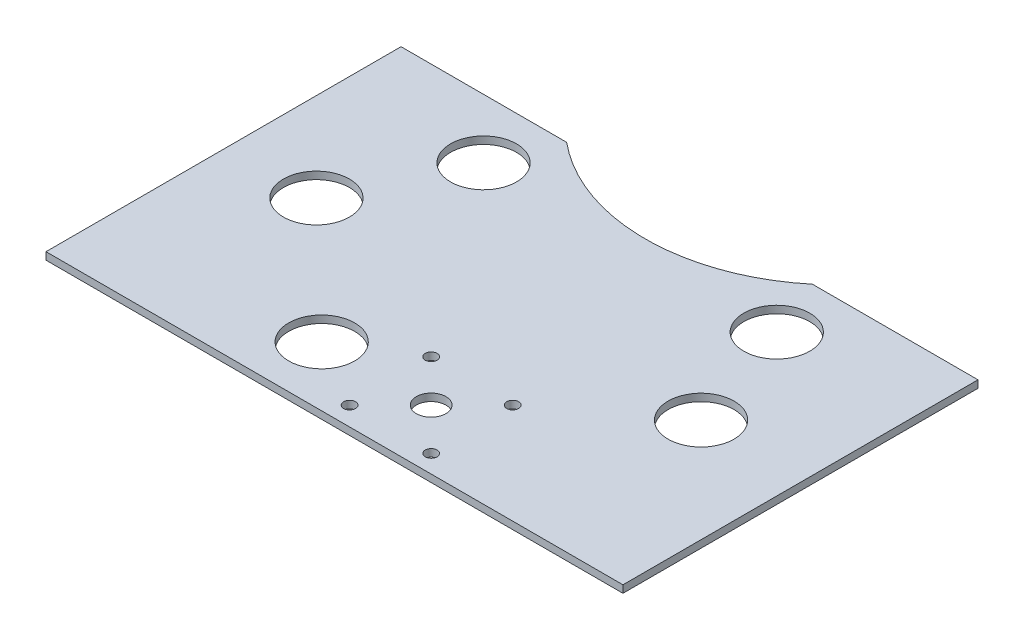
ISO-10303-21;
HEADER;
FILE_DESCRIPTION(('STEP AP214'),'2;1');
FILE_NAME('part.step','',(''),(''),'','','');
FILE_SCHEMA(('AUTOMOTIVE_DESIGN { 1 0 10303 214 1 1 1 1 }'));
ENDSEC;
DATA;
#1=APPLICATION_CONTEXT('core data for automotive mechanical design processes');
#2=APPLICATION_PROTOCOL_DEFINITION('international standard','automotive_design',2000,#1);
#3=PRODUCT_CONTEXT('',#1,'mechanical');
#4=PRODUCT('Part','Part','',(#3));
#5=PRODUCT_RELATED_PRODUCT_CATEGORY('part','',(#4));
#6=PRODUCT_DEFINITION_FORMATION('','',#4);
#7=PRODUCT_DEFINITION_CONTEXT('part definition',#1,'design');
#8=PRODUCT_DEFINITION('design','',#6,#7);
#9=PRODUCT_DEFINITION_SHAPE('','',#8);
#10=(LENGTH_UNIT() NAMED_UNIT(*) SI_UNIT(.MILLI.,.METRE.));
#11=(NAMED_UNIT(*) PLANE_ANGLE_UNIT() SI_UNIT($,.RADIAN.));
#12=(NAMED_UNIT(*) SI_UNIT($,.STERADIAN.) SOLID_ANGLE_UNIT());
#13=UNCERTAINTY_MEASURE_WITH_UNIT(LENGTH_MEASURE(1.E-05),#10,'distance_accuracy_value','');
#14=(GEOMETRIC_REPRESENTATION_CONTEXT(3) GLOBAL_UNCERTAINTY_ASSIGNED_CONTEXT((#13)) GLOBAL_UNIT_ASSIGNED_CONTEXT((#10,
#11,#12)) REPRESENTATION_CONTEXT('',''));
#15=CARTESIAN_POINT('',(0.,0.,0.));
#16=DIRECTION('',(0.,0.,1.));
#17=DIRECTION('',(1.,0.,0.));
#18=AXIS2_PLACEMENT_3D('',#15,#16,#17);
#19=CARTESIAN_POINT('',(-123.825,3.175,-96.52));
#20=DIRECTION('',(0.,0.,-1.));
#21=DIRECTION('',(-1.,0.,0.));
#22=AXIS2_PLACEMENT_3D('',#19,#20,#21);
#23=PLANE('',#22);
#24=DIRECTION('',(1.,0.,0.));
#25=VECTOR('',#24,1.);
#26=CARTESIAN_POINT('',(-123.825,0.,-96.52));
#27=LINE('',#26,#25);
#28=CARTESIAN_POINT('',(-123.825,0.,-96.52));
#29=VERTEX_POINT('',#28);
#30=CARTESIAN_POINT('',(-52.7470615295299,0.,-96.52));
#31=VERTEX_POINT('',#30);
#32=EDGE_CURVE('E129',#29,#31,#27,.T.);
#33=ORIENTED_EDGE('',*,*,#32,.F.);
#34=DIRECTION('',(0.,-1.,0.));
#35=VECTOR('',#34,1.);
#36=CARTESIAN_POINT('',(-123.825,3.175,-96.52));
#37=LINE('',#36,#35);
#38=CARTESIAN_POINT('',(-123.825,3.175,-96.52));
#39=VERTEX_POINT('',#38);
#40=EDGE_CURVE('E11',#39,#29,#37,.T.);
#41=ORIENTED_EDGE('',*,*,#40,.F.);
#42=DIRECTION('',(1.,0.,0.));
#43=VECTOR('',#42,1.);
#44=CARTESIAN_POINT('',(-123.825,3.175,-96.52));
#45=LINE('',#44,#43);
#46=CARTESIAN_POINT('',(-52.7470615295299,3.175,-96.52));
#47=VERTEX_POINT('',#46);
#48=EDGE_CURVE('E150',#39,#47,#45,.T.);
#49=ORIENTED_EDGE('',*,*,#48,.T.);
#50=DIRECTION('',(0.,-1.,0.));
#51=VECTOR('',#50,1.);
#52=CARTESIAN_POINT('',(-52.7470615295299,3.175,-96.52));
#53=LINE('',#52,#51);
#54=EDGE_CURVE('E42',#47,#31,#53,.T.);
#55=ORIENTED_EDGE('',*,*,#54,.T.);
#56=EDGE_LOOP('',(#33,#41,#49,#55));
#57=FACE_BOUND('',#56,.T.);
#58=ADVANCED_FACE('F39',(#57),#23,.T.);
#59=CARTESIAN_POINT('',(-123.825,3.175,55.88));
#60=DIRECTION('',(-1.,0.,0.));
#61=DIRECTION('',(0.,0.,1.));
#62=AXIS2_PLACEMENT_3D('',#59,#60,#61);
#63=PLANE('',#62);
#64=DIRECTION('',(0.,0.,-1.));
#65=VECTOR('',#64,1.);
#66=CARTESIAN_POINT('',(-123.825,0.,55.88));
#67=LINE('',#66,#65);
#68=CARTESIAN_POINT('',(-123.825,0.,55.88));
#69=VERTEX_POINT('',#68);
#70=EDGE_CURVE('E147',#69,#29,#67,.T.);
#71=ORIENTED_EDGE('',*,*,#70,.F.);
#72=DIRECTION('',(0.,-1.,0.));
#73=VECTOR('',#72,1.);
#74=CARTESIAN_POINT('',(-123.825,3.175,55.88));
#75=LINE('',#74,#73);
#76=CARTESIAN_POINT('',(-123.825,3.175,55.88));
#77=VERTEX_POINT('',#76);
#78=EDGE_CURVE('E49',#77,#69,#75,.T.);
#79=ORIENTED_EDGE('',*,*,#78,.F.);
#80=DIRECTION('',(0.,0.,-1.));
#81=VECTOR('',#80,1.);
#82=CARTESIAN_POINT('',(-123.825,3.175,55.88));
#83=LINE('',#82,#81);
#84=EDGE_CURVE('E104',#77,#39,#83,.T.);
#85=ORIENTED_EDGE('',*,*,#84,.T.);
#86=ORIENTED_EDGE('',*,*,#40,.T.);
#87=EDGE_LOOP('',(#71,#79,#85,#86));
#88=FACE_BOUND('',#87,.T.);
#89=ADVANCED_FACE('F163',(#88),#63,.T.);
#90=CARTESIAN_POINT('',(-123.825,3.175,55.88));
#91=DIRECTION('',(0.,0.,-1.));
#92=DIRECTION('',(-1.,0.,0.));
#93=AXIS2_PLACEMENT_3D('',#90,#91,#92);
#94=PLANE('',#93);
#95=DIRECTION('',(1.,0.,0.));
#96=VECTOR('',#95,1.);
#97=CARTESIAN_POINT('',(-123.825,0.,55.88));
#98=LINE('',#97,#96);
#99=CARTESIAN_POINT('',(123.825,0.,55.88));
#100=VERTEX_POINT('',#99);
#101=EDGE_CURVE('E110',#69,#100,#98,.T.);
#102=ORIENTED_EDGE('',*,*,#101,.T.);
#103=DIRECTION('',(0.,-1.,0.));
#104=VECTOR('',#103,1.);
#105=CARTESIAN_POINT('',(123.825,3.175,55.88));
#106=LINE('',#105,#104);
#107=CARTESIAN_POINT('',(123.825,3.175,55.88));
#108=VERTEX_POINT('',#107);
#109=EDGE_CURVE('E108',#108,#100,#106,.T.);
#110=ORIENTED_EDGE('',*,*,#109,.F.);
#111=DIRECTION('',(1.,0.,0.));
#112=VECTOR('',#111,1.);
#113=CARTESIAN_POINT('',(-123.825,3.175,55.88));
#114=LINE('',#113,#112);
#115=EDGE_CURVE('E98',#77,#108,#114,.T.);
#116=ORIENTED_EDGE('',*,*,#115,.F.);
#117=ORIENTED_EDGE('',*,*,#78,.T.);
#118=EDGE_LOOP('',(#102,#110,#116,#117));
#119=FACE_BOUND('',#118,.T.);
#120=ADVANCED_FACE('F109',(#119),#94,.F.);
#121=CARTESIAN_POINT('',(123.825,3.175,55.88));
#122=DIRECTION('',(-1.,0.,0.));
#123=DIRECTION('',(0.,0.,1.));
#124=AXIS2_PLACEMENT_3D('',#121,#122,#123);
#125=PLANE('',#124);
#126=DIRECTION('',(0.,0.,-1.));
#127=VECTOR('',#126,1.);
#128=CARTESIAN_POINT('',(123.825,0.,55.88));
#129=LINE('',#128,#127);
#130=CARTESIAN_POINT('',(123.825,0.,-96.52));
#131=VERTEX_POINT('',#130);
#132=EDGE_CURVE('E142',#100,#131,#129,.T.);
#133=ORIENTED_EDGE('',*,*,#132,.T.);
#134=DIRECTION('',(0.,-1.,0.));
#135=VECTOR('',#134,1.);
#136=CARTESIAN_POINT('',(123.825,3.175,-96.52));
#137=LINE('',#136,#135);
#138=CARTESIAN_POINT('',(123.825,3.175,-96.52));
#139=VERTEX_POINT('',#138);
#140=EDGE_CURVE('E114',#139,#131,#137,.T.);
#141=ORIENTED_EDGE('',*,*,#140,.F.);
#142=DIRECTION('',(0.,0.,-1.));
#143=VECTOR('',#142,1.);
#144=CARTESIAN_POINT('',(123.825,3.175,55.88));
#145=LINE('',#144,#143);
#146=EDGE_CURVE('E102',#108,#139,#145,.T.);
#147=ORIENTED_EDGE('',*,*,#146,.F.);
#148=ORIENTED_EDGE('',*,*,#109,.T.);
#149=EDGE_LOOP('',(#133,#141,#147,#148));
#150=FACE_BOUND('',#149,.T.);
#151=ADVANCED_FACE('F116',(#150),#125,.F.);
#152=CARTESIAN_POINT('',(123.825,3.175,-96.52));
#153=DIRECTION('',(0.,0.,1.));
#154=DIRECTION('',(1.,0.,0.));
#155=AXIS2_PLACEMENT_3D('',#152,#153,#154);
#156=PLANE('',#155);
#157=DIRECTION('',(-1.,0.,0.));
#158=VECTOR('',#157,1.);
#159=CARTESIAN_POINT('',(123.825,0.,-96.52));
#160=LINE('',#159,#158);
#161=CARTESIAN_POINT('',(52.7470615295298,0.,-96.52));
#162=VERTEX_POINT('',#161);
#163=EDGE_CURVE('E138',#131,#162,#160,.T.);
#164=ORIENTED_EDGE('',*,*,#163,.T.);
#165=DIRECTION('',(0.,-1.,0.));
#166=VECTOR('',#165,1.);
#167=CARTESIAN_POINT('',(52.7470615295298,3.175,-96.52));
#168=LINE('',#167,#166);
#169=CARTESIAN_POINT('',(52.7470615295298,3.175,-96.52));
#170=VERTEX_POINT('',#169);
#171=EDGE_CURVE('E155',#170,#162,#168,.T.);
#172=ORIENTED_EDGE('',*,*,#171,.F.);
#173=DIRECTION('',(-1.,0.,0.));
#174=VECTOR('',#173,1.);
#175=CARTESIAN_POINT('',(123.825,3.175,-96.52));
#176=LINE('',#175,#174);
#177=EDGE_CURVE('E120',#139,#170,#176,.T.);
#178=ORIENTED_EDGE('',*,*,#177,.F.);
#179=ORIENTED_EDGE('',*,*,#140,.T.);
#180=EDGE_LOOP('',(#164,#172,#178,#179));
#181=FACE_BOUND('',#180,.T.);
#182=ADVANCED_FACE('F176',(#181),#156,.F.);
#183=CARTESIAN_POINT('',(0.,3.175,-160.02));
#184=DIRECTION('',(0.,-1.,0.));
#185=DIRECTION('',(0.,0.,-1.));
#186=AXIS2_PLACEMENT_3D('',#183,#184,#185);
#187=CYLINDRICAL_SURFACE('',#186,82.55);
#188=CARTESIAN_POINT('',(0.,0.,-160.02));
#189=DIRECTION('',(0.,1.,0.));
#190=DIRECTION('',(0.,0.,1.));
#191=AXIS2_PLACEMENT_3D('',#188,#189,#190);
#192=CIRCLE('',#191,82.55);
#193=EDGE_CURVE('E133',#31,#162,#192,.T.);
#194=ORIENTED_EDGE('',*,*,#193,.F.);
#195=ORIENTED_EDGE('',*,*,#54,.F.);
#196=CARTESIAN_POINT('',(0.,3.175,-160.02));
#197=DIRECTION('',(0.,1.,0.));
#198=DIRECTION('',(0.,0.,1.));
#199=AXIS2_PLACEMENT_3D('',#196,#197,#198);
#200=CIRCLE('',#199,82.55);
#201=EDGE_CURVE('E123',#47,#170,#200,.T.);
#202=ORIENTED_EDGE('',*,*,#201,.T.);
#203=ORIENTED_EDGE('',*,*,#171,.T.);
#204=EDGE_LOOP('',(#194,#195,#202,#203));
#205=FACE_BOUND('',#204,.T.);
#206=ADVANCED_FACE('F159',(#205),#187,.F.);
#207=CARTESIAN_POINT('',(0.,3.175,-160.02));
#208=DIRECTION('',(0.,1.,0.));
#209=DIRECTION('',(0.,0.,1.));
#210=AXIS2_PLACEMENT_3D('',#207,#208,#209);
#211=PLANE('',#210);
#212=CARTESIAN_POINT('',(62.9334955393349,3.175,-71.0350243309003));
#213=DIRECTION('',(0.,-1.,0.));
#214=DIRECTION('',(0.,0.,1.));
#215=AXIS2_PLACEMENT_3D('',#212,#213,#214);
#216=CIRCLE('',#215,14.1605);
#217=CARTESIAN_POINT('',(62.9334955393349,3.175,-56.8745243309003));
#218=VERTEX_POINT('',#217);
#219=EDGE_CURVE('E237',#218,#218,#216,.T.);
#220=ORIENTED_EDGE('',*,*,#219,.T.);
#221=EDGE_LOOP('',(#220));
#222=FACE_BOUND('',#221,.T.);
#223=CARTESIAN_POINT('',(-62.9334955393349,3.175,-71.0350243309003));
#224=DIRECTION('',(0.,1.,0.));
#225=DIRECTION('',(0.,0.,1.));
#226=AXIS2_PLACEMENT_3D('',#223,#224,#225);
#227=CIRCLE('',#226,14.1605);
#228=CARTESIAN_POINT('',(-62.9334955393349,3.175,-56.8745243309003));
#229=VERTEX_POINT('',#228);
#230=EDGE_CURVE('E241',#229,#229,#227,.T.);
#231=ORIENTED_EDGE('',*,*,#230,.F.);
#232=EDGE_LOOP('',(#231));
#233=FACE_BOUND('',#232,.T.);
#234=CARTESIAN_POINT('',(-31.115,3.175,30.2569424475206));
#235=DIRECTION('',(0.,1.,0.));
#236=DIRECTION('',(0.,0.,1.));
#237=AXIS2_PLACEMENT_3D('',#234,#235,#236);
#238=CIRCLE('',#237,14.1605);
#239=CARTESIAN_POINT('',(-31.115,3.175,44.4174424475206));
#240=VERTEX_POINT('',#239);
#241=EDGE_CURVE('E248',#240,#240,#238,.T.);
#242=ORIENTED_EDGE('',*,*,#241,.F.);
#243=EDGE_LOOP('',(#242));
#244=FACE_BOUND('',#243,.T.);
#245=CARTESIAN_POINT('',(-85.725,3.175,-22.098));
#246=DIRECTION('',(0.,-1.,0.));
#247=DIRECTION('',(0.,0.,-1.));
#248=AXIS2_PLACEMENT_3D('',#245,#246,#247);
#249=CIRCLE('',#248,14.1605);
#250=CARTESIAN_POINT('',(-85.725,3.175,-36.2585));
#251=VERTEX_POINT('',#250);
#252=EDGE_CURVE('E256',#251,#251,#249,.T.);
#253=ORIENTED_EDGE('',*,*,#252,.T.);
#254=EDGE_LOOP('',(#253));
#255=FACE_BOUND('',#254,.T.);
#256=CARTESIAN_POINT('',(79.375,3.175,-22.098));
#257=DIRECTION('',(0.,-1.,0.));
#258=DIRECTION('',(0.,0.,-1.));
#259=AXIS2_PLACEMENT_3D('',#256,#257,#258);
#260=CIRCLE('',#259,14.1605);
#261=CARTESIAN_POINT('',(79.375,3.175,-36.2585));
#262=VERTEX_POINT('',#261);
#263=EDGE_CURVE('E267',#262,#262,#260,.T.);
#264=ORIENTED_EDGE('',*,*,#263,.T.);
#265=EDGE_LOOP('',(#264));
#266=FACE_BOUND('',#265,.T.);
#267=CARTESIAN_POINT('',(-1.62500000000002,3.175,47.7569424475206));
#268=DIRECTION('',(0.,1.,0.));
#269=DIRECTION('',(0.,0.,1.));
#270=AXIS2_PLACEMENT_3D('',#267,#268,#269);
#271=CIRCLE('',#270,2.5527);
#272=CARTESIAN_POINT('',(-1.62500000000002,3.175,50.3096424475206));
#273=VERTEX_POINT('',#272);
#274=EDGE_CURVE('E275',#273,#273,#271,.T.);
#275=ORIENTED_EDGE('',*,*,#274,.F.);
#276=EDGE_LOOP('',(#275));
#277=FACE_BOUND('',#276,.T.);
#278=CARTESIAN_POINT('',(33.375,3.175,12.7569424475206));
#279=DIRECTION('',(0.,1.,0.));
#280=DIRECTION('',(0.,0.,1.));
#281=AXIS2_PLACEMENT_3D('',#278,#279,#280);
#282=CIRCLE('',#281,2.5527);
#283=CARTESIAN_POINT('',(33.375,3.175,15.3096424475206));
#284=VERTEX_POINT('',#283);
#285=EDGE_CURVE('E283',#284,#284,#282,.T.);
#286=ORIENTED_EDGE('',*,*,#285,.F.);
#287=EDGE_LOOP('',(#286));
#288=FACE_BOUND('',#287,.T.);
#289=CARTESIAN_POINT('',(-2.08551224213836,3.175,12.2964302053823));
#290=DIRECTION('',(0.,1.,0.));
#291=DIRECTION('',(0.,0.,1.));
#292=AXIS2_PLACEMENT_3D('',#289,#290,#291);
#293=CIRCLE('',#292,2.5527);
#294=CARTESIAN_POINT('',(-2.08551224213836,3.175,14.8491302053823));
#295=VERTEX_POINT('',#294);
#296=EDGE_CURVE('E291',#295,#295,#293,.T.);
#297=ORIENTED_EDGE('',*,*,#296,.F.);
#298=EDGE_LOOP('',(#297));
#299=FACE_BOUND('',#298,.T.);
#300=CARTESIAN_POINT('',(33.8355122421383,3.175,48.2174546896589));
#301=DIRECTION('',(0.,1.,0.));
#302=DIRECTION('',(0.,0.,1.));
#303=AXIS2_PLACEMENT_3D('',#300,#301,#302);
#304=CIRCLE('',#303,2.5527);
#305=CARTESIAN_POINT('',(33.8355122421383,3.175,50.7701546896589));
#306=VERTEX_POINT('',#305);
#307=EDGE_CURVE('E299',#306,#306,#304,.T.);
#308=ORIENTED_EDGE('',*,*,#307,.F.);
#309=EDGE_LOOP('',(#308));
#310=FACE_BOUND('',#309,.T.);
#311=CARTESIAN_POINT('',(15.875,3.175,30.2569424475206));
#312=DIRECTION('',(0.,1.,0.));
#313=DIRECTION('',(0.,0.,1.));
#314=AXIS2_PLACEMENT_3D('',#311,#312,#313);
#315=CIRCLE('',#314,6.35);
#316=CARTESIAN_POINT('',(15.875,3.175,36.6069424475206));
#317=VERTEX_POINT('',#316);
#318=EDGE_CURVE('E307',#317,#317,#315,.T.);
#319=ORIENTED_EDGE('',*,*,#318,.F.);
#320=EDGE_LOOP('',(#319));
#321=FACE_BOUND('',#320,.T.);
#322=ORIENTED_EDGE('',*,*,#48,.F.);
#323=ORIENTED_EDGE('',*,*,#84,.F.);
#324=ORIENTED_EDGE('',*,*,#115,.T.);
#325=ORIENTED_EDGE('',*,*,#146,.T.);
#326=ORIENTED_EDGE('',*,*,#177,.T.);
#327=ORIENTED_EDGE('',*,*,#201,.F.);
#328=EDGE_LOOP('',(#322,#323,#324,#325,#326,#327));
#329=FACE_BOUND('',#328,.T.);
#330=ADVANCED_FACE('F100',(#222,#233,#244,#255,#266,#277,#288,#299,#310,#321,#329),#211,.T.);
#331=CARTESIAN_POINT('',(0.,0.,-160.02));
#332=DIRECTION('',(0.,1.,0.));
#333=DIRECTION('',(0.,0.,1.));
#334=AXIS2_PLACEMENT_3D('',#331,#332,#333);
#335=PLANE('',#334);
#336=CARTESIAN_POINT('',(62.9334955393349,0.,-71.0350243309003));
#337=DIRECTION('',(0.,-1.,0.));
#338=DIRECTION('',(0.,0.,1.));
#339=AXIS2_PLACEMENT_3D('',#336,#337,#338);
#340=CIRCLE('',#339,14.1605);
#341=CARTESIAN_POINT('',(62.9334955393349,0.,-56.8745243309003));
#342=VERTEX_POINT('',#341);
#343=EDGE_CURVE('E235',#342,#342,#340,.T.);
#344=ORIENTED_EDGE('',*,*,#343,.F.);
#345=EDGE_LOOP('',(#344));
#346=FACE_BOUND('',#345,.T.);
#347=CARTESIAN_POINT('',(-62.9334955393349,0.,-71.0350243309003));
#348=DIRECTION('',(0.,1.,0.));
#349=DIRECTION('',(0.,0.,1.));
#350=AXIS2_PLACEMENT_3D('',#347,#348,#349);
#351=CIRCLE('',#350,14.1605);
#352=CARTESIAN_POINT('',(-62.9334955393349,0.,-56.8745243309003));
#353=VERTEX_POINT('',#352);
#354=EDGE_CURVE('E244',#353,#353,#351,.T.);
#355=ORIENTED_EDGE('',*,*,#354,.T.);
#356=EDGE_LOOP('',(#355));
#357=FACE_BOUND('',#356,.T.);
#358=CARTESIAN_POINT('',(-31.115,0.,30.2569424475206));
#359=DIRECTION('',(0.,1.,0.));
#360=DIRECTION('',(0.,0.,1.));
#361=AXIS2_PLACEMENT_3D('',#358,#359,#360);
#362=CIRCLE('',#361,14.1605);
#363=CARTESIAN_POINT('',(-31.115,0.,44.4174424475206));
#364=VERTEX_POINT('',#363);
#365=EDGE_CURVE('E252',#364,#364,#362,.T.);
#366=ORIENTED_EDGE('',*,*,#365,.T.);
#367=EDGE_LOOP('',(#366));
#368=FACE_BOUND('',#367,.T.);
#369=CARTESIAN_POINT('',(-85.725,0.,-22.098));
#370=DIRECTION('',(0.,1.,0.));
#371=DIRECTION('',(0.,0.,1.));
#372=AXIS2_PLACEMENT_3D('',#369,#370,#371);
#373=CIRCLE('',#372,14.1605);
#374=CARTESIAN_POINT('',(-85.725,0.,-7.93749999999999));
#375=VERTEX_POINT('',#374);
#376=EDGE_CURVE('E263',#375,#375,#373,.T.);
#377=ORIENTED_EDGE('',*,*,#376,.T.);
#378=EDGE_LOOP('',(#377));
#379=FACE_BOUND('',#378,.T.);
#380=CARTESIAN_POINT('',(79.375,0.,-22.098));
#381=DIRECTION('',(0.,1.,0.));
#382=DIRECTION('',(0.,0.,1.));
#383=AXIS2_PLACEMENT_3D('',#380,#381,#382);
#384=CIRCLE('',#383,14.1605);
#385=CARTESIAN_POINT('',(79.375,0.,-7.93749999999999));
#386=VERTEX_POINT('',#385);
#387=EDGE_CURVE('E271',#386,#386,#384,.T.);
#388=ORIENTED_EDGE('',*,*,#387,.T.);
#389=EDGE_LOOP('',(#388));
#390=FACE_BOUND('',#389,.T.);
#391=CARTESIAN_POINT('',(-1.62500000000002,0.,47.7569424475206));
#392=DIRECTION('',(0.,1.,0.));
#393=DIRECTION('',(0.,0.,1.));
#394=AXIS2_PLACEMENT_3D('',#391,#392,#393);
#395=CIRCLE('',#394,2.5527);
#396=CARTESIAN_POINT('',(-1.62500000000002,0.,50.3096424475206));
#397=VERTEX_POINT('',#396);
#398=EDGE_CURVE('E279',#397,#397,#395,.T.);
#399=ORIENTED_EDGE('',*,*,#398,.T.);
#400=EDGE_LOOP('',(#399));
#401=FACE_BOUND('',#400,.T.);
#402=CARTESIAN_POINT('',(33.375,0.,12.7569424475206));
#403=DIRECTION('',(0.,1.,0.));
#404=DIRECTION('',(0.,0.,1.));
#405=AXIS2_PLACEMENT_3D('',#402,#403,#404);
#406=CIRCLE('',#405,2.5527);
#407=CARTESIAN_POINT('',(33.375,0.,15.3096424475206));
#408=VERTEX_POINT('',#407);
#409=EDGE_CURVE('E287',#408,#408,#406,.T.);
#410=ORIENTED_EDGE('',*,*,#409,.T.);
#411=EDGE_LOOP('',(#410));
#412=FACE_BOUND('',#411,.T.);
#413=CARTESIAN_POINT('',(-2.08551224213836,0.,12.2964302053823));
#414=DIRECTION('',(0.,1.,0.));
#415=DIRECTION('',(0.,0.,1.));
#416=AXIS2_PLACEMENT_3D('',#413,#414,#415);
#417=CIRCLE('',#416,2.5527);
#418=CARTESIAN_POINT('',(-2.08551224213836,0.,14.8491302053823));
#419=VERTEX_POINT('',#418);
#420=EDGE_CURVE('E295',#419,#419,#417,.T.);
#421=ORIENTED_EDGE('',*,*,#420,.T.);
#422=EDGE_LOOP('',(#421));
#423=FACE_BOUND('',#422,.T.);
#424=CARTESIAN_POINT('',(33.8355122421383,0.,48.2174546896589));
#425=DIRECTION('',(0.,1.,0.));
#426=DIRECTION('',(0.,0.,1.));
#427=AXIS2_PLACEMENT_3D('',#424,#425,#426);
#428=CIRCLE('',#427,2.5527);
#429=CARTESIAN_POINT('',(33.8355122421383,0.,50.7701546896589));
#430=VERTEX_POINT('',#429);
#431=EDGE_CURVE('E303',#430,#430,#428,.T.);
#432=ORIENTED_EDGE('',*,*,#431,.T.);
#433=EDGE_LOOP('',(#432));
#434=FACE_BOUND('',#433,.T.);
#435=CARTESIAN_POINT('',(15.875,0.,30.2569424475206));
#436=DIRECTION('',(0.,1.,0.));
#437=DIRECTION('',(0.,0.,1.));
#438=AXIS2_PLACEMENT_3D('',#435,#436,#437);
#439=CIRCLE('',#438,6.35);
#440=CARTESIAN_POINT('',(15.875,0.,36.6069424475206));
#441=VERTEX_POINT('',#440);
#442=EDGE_CURVE('E134',#441,#441,#439,.T.);
#443=ORIENTED_EDGE('',*,*,#442,.T.);
#444=EDGE_LOOP('',(#443));
#445=FACE_BOUND('',#444,.T.);
#446=ORIENTED_EDGE('',*,*,#32,.T.);
#447=ORIENTED_EDGE('',*,*,#193,.T.);
#448=ORIENTED_EDGE('',*,*,#163,.F.);
#449=ORIENTED_EDGE('',*,*,#132,.F.);
#450=ORIENTED_EDGE('',*,*,#101,.F.);
#451=ORIENTED_EDGE('',*,*,#70,.T.);
#452=EDGE_LOOP('',(#446,#447,#448,#449,#450,#451));
#453=FACE_BOUND('',#452,.T.);
#454=ADVANCED_FACE('F162',(#346,#357,#368,#379,#390,#401,#412,#423,#434,#445,#453),#335,.F.);
#455=CARTESIAN_POINT('',(15.875,3.175,30.2569424475206));
#456=DIRECTION('',(0.,1.,0.));
#457=DIRECTION('',(0.,0.,1.));
#458=AXIS2_PLACEMENT_3D('',#455,#456,#457);
#459=CYLINDRICAL_SURFACE('',#458,6.35);
#460=ORIENTED_EDGE('',*,*,#442,.F.);
#461=EDGE_LOOP('',(#460));
#462=FACE_BOUND('',#461,.T.);
#463=ORIENTED_EDGE('',*,*,#318,.T.);
#464=EDGE_LOOP('',(#463));
#465=FACE_BOUND('',#464,.T.);
#466=ADVANCED_FACE('F187',(#462,#465),#459,.F.);
#467=CARTESIAN_POINT('',(33.8355122421383,3.175,48.2174546896589));
#468=DIRECTION('',(0.,1.,0.));
#469=DIRECTION('',(0.,0.,1.));
#470=AXIS2_PLACEMENT_3D('',#467,#468,#469);
#471=CYLINDRICAL_SURFACE('',#470,2.5527);
#472=ORIENTED_EDGE('',*,*,#431,.F.);
#473=EDGE_LOOP('',(#472));
#474=FACE_BOUND('',#473,.T.);
#475=ORIENTED_EDGE('',*,*,#307,.T.);
#476=EDGE_LOOP('',(#475));
#477=FACE_BOUND('',#476,.T.);
#478=ADVANCED_FACE('F194',(#474,#477),#471,.F.);
#479=CARTESIAN_POINT('',(-2.08551224213836,3.175,12.2964302053823));
#480=DIRECTION('',(0.,1.,0.));
#481=DIRECTION('',(0.,0.,1.));
#482=AXIS2_PLACEMENT_3D('',#479,#480,#481);
#483=CYLINDRICAL_SURFACE('',#482,2.5527);
#484=ORIENTED_EDGE('',*,*,#420,.F.);
#485=EDGE_LOOP('',(#484));
#486=FACE_BOUND('',#485,.T.);
#487=ORIENTED_EDGE('',*,*,#296,.T.);
#488=EDGE_LOOP('',(#487));
#489=FACE_BOUND('',#488,.T.);
#490=ADVANCED_FACE('F198',(#486,#489),#483,.F.);
#491=CARTESIAN_POINT('',(33.375,3.175,12.7569424475206));
#492=DIRECTION('',(0.,1.,0.));
#493=DIRECTION('',(0.,0.,1.));
#494=AXIS2_PLACEMENT_3D('',#491,#492,#493);
#495=CYLINDRICAL_SURFACE('',#494,2.5527);
#496=ORIENTED_EDGE('',*,*,#409,.F.);
#497=EDGE_LOOP('',(#496));
#498=FACE_BOUND('',#497,.T.);
#499=ORIENTED_EDGE('',*,*,#285,.T.);
#500=EDGE_LOOP('',(#499));
#501=FACE_BOUND('',#500,.T.);
#502=ADVANCED_FACE('F202',(#498,#501),#495,.F.);
#503=CARTESIAN_POINT('',(-1.62500000000002,3.175,47.7569424475206));
#504=DIRECTION('',(0.,1.,0.));
#505=DIRECTION('',(0.,0.,1.));
#506=AXIS2_PLACEMENT_3D('',#503,#504,#505);
#507=CYLINDRICAL_SURFACE('',#506,2.5527);
#508=ORIENTED_EDGE('',*,*,#398,.F.);
#509=EDGE_LOOP('',(#508));
#510=FACE_BOUND('',#509,.T.);
#511=ORIENTED_EDGE('',*,*,#274,.T.);
#512=EDGE_LOOP('',(#511));
#513=FACE_BOUND('',#512,.T.);
#514=ADVANCED_FACE('F206',(#510,#513),#507,.F.);
#515=CARTESIAN_POINT('',(79.375,-34.925,-22.098));
#516=DIRECTION('',(0.,-1.,0.));
#517=DIRECTION('',(0.,0.,-1.));
#518=AXIS2_PLACEMENT_3D('',#515,#516,#517);
#519=CYLINDRICAL_SURFACE('',#518,14.1605);
#520=ORIENTED_EDGE('',*,*,#263,.F.);
#521=EDGE_LOOP('',(#520));
#522=FACE_BOUND('',#521,.T.);
#523=ORIENTED_EDGE('',*,*,#387,.F.);
#524=EDGE_LOOP('',(#523));
#525=FACE_BOUND('',#524,.T.);
#526=ADVANCED_FACE('F210',(#522,#525),#519,.F.);
#527=CARTESIAN_POINT('',(-85.725,-34.925,-22.098));
#528=DIRECTION('',(0.,-1.,0.));
#529=DIRECTION('',(0.,0.,-1.));
#530=AXIS2_PLACEMENT_3D('',#527,#528,#529);
#531=CYLINDRICAL_SURFACE('',#530,14.1605);
#532=ORIENTED_EDGE('',*,*,#252,.F.);
#533=EDGE_LOOP('',(#532));
#534=FACE_BOUND('',#533,.T.);
#535=ORIENTED_EDGE('',*,*,#376,.F.);
#536=EDGE_LOOP('',(#535));
#537=FACE_BOUND('',#536,.T.);
#538=ADVANCED_FACE('F214',(#534,#537),#531,.F.);
#539=CARTESIAN_POINT('',(-31.115,0.,30.2569424475206));
#540=DIRECTION('',(0.,1.,0.));
#541=DIRECTION('',(0.,0.,1.));
#542=AXIS2_PLACEMENT_3D('',#539,#540,#541);
#543=CYLINDRICAL_SURFACE('',#542,14.1605);
#544=ORIENTED_EDGE('',*,*,#365,.F.);
#545=EDGE_LOOP('',(#544));
#546=FACE_BOUND('',#545,.T.);
#547=ORIENTED_EDGE('',*,*,#241,.T.);
#548=EDGE_LOOP('',(#547));
#549=FACE_BOUND('',#548,.T.);
#550=ADVANCED_FACE('F218',(#546,#549),#543,.F.);
#551=CARTESIAN_POINT('',(-62.9334955393349,0.,-71.0350243309003));
#552=DIRECTION('',(0.,1.,0.));
#553=DIRECTION('',(0.,0.,1.));
#554=AXIS2_PLACEMENT_3D('',#551,#552,#553);
#555=CYLINDRICAL_SURFACE('',#554,14.1605);
#556=ORIENTED_EDGE('',*,*,#354,.F.);
#557=EDGE_LOOP('',(#556));
#558=FACE_BOUND('',#557,.T.);
#559=ORIENTED_EDGE('',*,*,#230,.T.);
#560=EDGE_LOOP('',(#559));
#561=FACE_BOUND('',#560,.T.);
#562=ADVANCED_FACE('F222',(#558,#561),#555,.F.);
#563=CARTESIAN_POINT('',(62.9334955393349,0.,-71.0350243309003));
#564=DIRECTION('',(0.,1.,0.));
#565=DIRECTION('',(0.,0.,1.));
#566=AXIS2_PLACEMENT_3D('',#563,#564,#565);
#567=CYLINDRICAL_SURFACE('',#566,14.1605);
#568=ORIENTED_EDGE('',*,*,#343,.T.);
#569=EDGE_LOOP('',(#568));
#570=FACE_BOUND('',#569,.T.);
#571=ORIENTED_EDGE('',*,*,#219,.F.);
#572=EDGE_LOOP('',(#571));
#573=FACE_BOUND('',#572,.T.);
#574=ADVANCED_FACE('F226',(#570,#573),#567,.F.);
#575=CLOSED_SHELL('',(#58,#89,#120,#151,#182,#206,#330,#454,#466,#478,#490,#502,#514,#526,#538,
#550,#562,#574));
#576=MANIFOLD_SOLID_BREP('B2',#575);
#577=ADVANCED_BREP_SHAPE_REPRESENTATION('',(#18,#576),#14);
#578=SHAPE_DEFINITION_REPRESENTATION(#9,#577);
ENDSEC;
END-ISO-10303-21;
